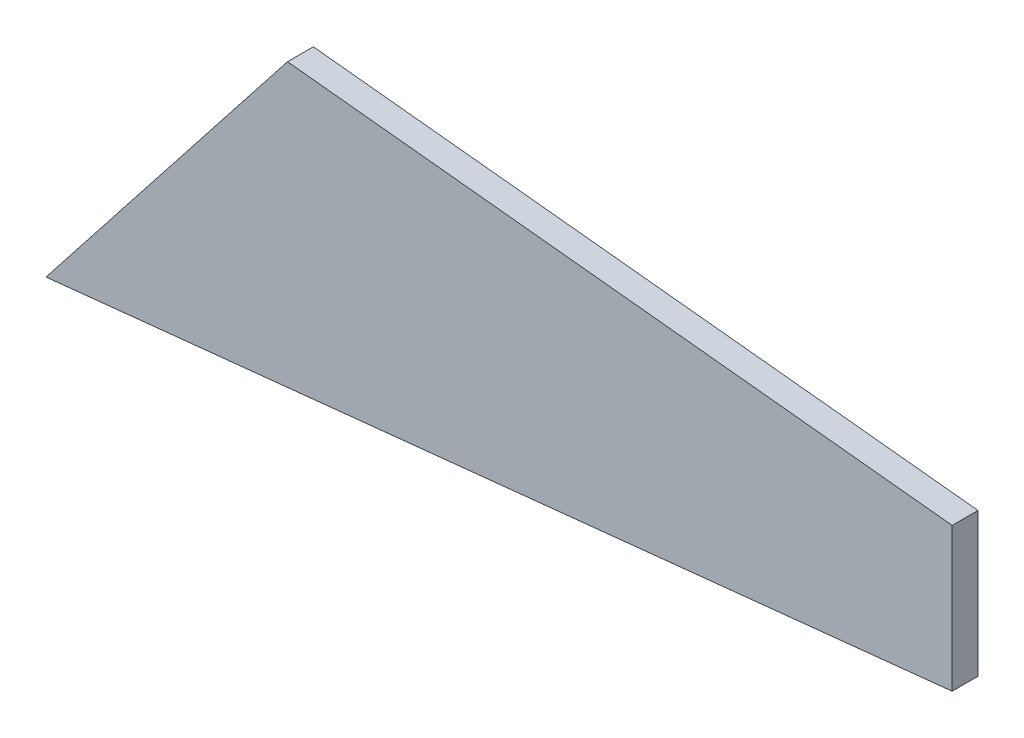
ISO-10303-21;
HEADER;
FILE_DESCRIPTION(('STEP AP214'),'2;1');
FILE_NAME('part.step','',(''),(''),'','','');
FILE_SCHEMA(('AUTOMOTIVE_DESIGN { 1 0 10303 214 1 1 1 1 }'));
ENDSEC;
DATA;
#1=APPLICATION_CONTEXT('core data for automotive mechanical design processes');
#2=APPLICATION_PROTOCOL_DEFINITION('international standard','automotive_design',2000,#1);
#3=PRODUCT_CONTEXT('',#1,'mechanical');
#4=PRODUCT('Part','Part','',(#3));
#5=PRODUCT_RELATED_PRODUCT_CATEGORY('part','',(#4));
#6=PRODUCT_DEFINITION_FORMATION('','',#4);
#7=PRODUCT_DEFINITION_CONTEXT('part definition',#1,'design');
#8=PRODUCT_DEFINITION('design','',#6,#7);
#9=PRODUCT_DEFINITION_SHAPE('','',#8);
#10=(LENGTH_UNIT() NAMED_UNIT(*) SI_UNIT(.MILLI.,.METRE.));
#11=(NAMED_UNIT(*) PLANE_ANGLE_UNIT() SI_UNIT($,.RADIAN.));
#12=(NAMED_UNIT(*) SI_UNIT($,.STERADIAN.) SOLID_ANGLE_UNIT());
#13=UNCERTAINTY_MEASURE_WITH_UNIT(LENGTH_MEASURE(1.E-05),#10,'distance_accuracy_value','');
#14=(GEOMETRIC_REPRESENTATION_CONTEXT(3) GLOBAL_UNCERTAINTY_ASSIGNED_CONTEXT((#13)) GLOBAL_UNIT_ASSIGNED_CONTEXT((#10,
#11,#12)) REPRESENTATION_CONTEXT('',''));
#15=CARTESIAN_POINT('',(0.,0.,0.));
#16=DIRECTION('',(0.,0.,1.));
#17=DIRECTION('',(1.,0.,0.));
#18=AXIS2_PLACEMENT_3D('',#15,#16,#17);
#19=CARTESIAN_POINT('',(180.,16.666666666667,0.));
#20=DIRECTION('',(-0.103606084258982,-0.994618408890827,0.));
#21=DIRECTION('',(-0.994618408890827,0.103606084258982,0.));
#22=AXIS2_PLACEMENT_3D('',#19,#20,#21);
#23=PLANE('',#22);
#24=DIRECTION('',(0.,0.,1.));
#25=VECTOR('',#24,1.);
#26=CARTESIAN_POINT('',(25.732634626158,32.736183893109,-10917.5));
#27=LINE('',#26,#25);
#28=CARTESIAN_POINT('',(25.732634626158,32.736183893109,0.));
#29=VERTEX_POINT('',#28);
#30=CARTESIAN_POINT('',(25.732634626158,32.736183893109,6.));
#31=VERTEX_POINT('',#30);
#32=EDGE_CURVE('E11',#29,#31,#27,.T.);
#33=ORIENTED_EDGE('',*,*,#32,.T.);
#34=DIRECTION('',(-0.994618408890827,0.103606084258982,0.));
#35=VECTOR('',#34,1.);
#36=CARTESIAN_POINT('',(180.,16.666666666667,6.));
#37=LINE('',#36,#35);
#38=CARTESIAN_POINT('',(180.,16.666666666667,6.));
#39=VERTEX_POINT('',#38);
#40=EDGE_CURVE('E25',#39,#31,#37,.T.);
#41=ORIENTED_EDGE('',*,*,#40,.F.);
#42=DIRECTION('',(0.,0.,1.));
#43=VECTOR('',#42,1.);
#44=CARTESIAN_POINT('',(180.,16.666666666667,0.));
#45=LINE('',#44,#43);
#46=CARTESIAN_POINT('',(180.,16.666666666667,0.));
#47=VERTEX_POINT('',#46);
#48=EDGE_CURVE('E103',#47,#39,#45,.T.);
#49=ORIENTED_EDGE('',*,*,#48,.F.);
#50=DIRECTION('',(-0.994618408890827,0.103606084258982,0.));
#51=VECTOR('',#50,1.);
#52=CARTESIAN_POINT('',(180.,16.666666666667,0.));
#53=LINE('',#52,#51);
#54=EDGE_CURVE('E74',#47,#29,#53,.T.);
#55=ORIENTED_EDGE('',*,*,#54,.T.);
#56=EDGE_LOOP('',(#33,#41,#49,#55));
#57=FACE_BOUND('',#56,.T.);
#58=ADVANCED_FACE('F17',(#57),#23,.F.);
#59=CARTESIAN_POINT('',(-11720.18096252,-14910.01620408,-21835.));
#60=DIRECTION('',(0.786185932195091,-0.617990032297072,0.));
#61=DIRECTION('',(0.,0.,-1.));
#62=AXIS2_PLACEMENT_3D('',#59,#60,#61);
#63=PLANE('',#62);
#64=ORIENTED_EDGE('',*,*,#32,.F.);
#65=DIRECTION('',(0.617990032297072,0.786185932195091,0.));
#66=VECTOR('',#65,1.);
#67=CARTESIAN_POINT('',(-5858.893496657,-7453.485338875,1.136868377216E-12));
#68=LINE('',#67,#66);
#69=CARTESIAN_POINT('',(-30.32250485139,-38.57526092202,2.273736754432E-13));
#70=VERTEX_POINT('',#69);
#71=EDGE_CURVE('E79',#70,#29,#68,.T.);
#72=ORIENTED_EDGE('',*,*,#71,.F.);
#73=DIRECTION('',(0.,0.,-1.));
#74=VECTOR('',#73,1.);
#75=CARTESIAN_POINT('',(-30.3225048514,-38.57526092202,-10917.5));
#76=LINE('',#75,#74);
#77=CARTESIAN_POINT('',(-30.32250485139,-38.57526092202,6.));
#78=VERTEX_POINT('',#77);
#79=EDGE_CURVE('E87',#78,#70,#76,.T.);
#80=ORIENTED_EDGE('',*,*,#79,.F.);
#81=DIRECTION('',(0.617990032297072,0.786185932195091,0.));
#82=VECTOR('',#81,1.);
#83=CARTESIAN_POINT('',(-5858.893496657,-7453.485338875,6.000000000001));
#84=LINE('',#83,#82);
#85=EDGE_CURVE('E111',#78,#31,#84,.T.);
#86=ORIENTED_EDGE('',*,*,#85,.T.);
#87=EDGE_LOOP('',(#64,#72,#80,#86));
#88=FACE_BOUND('',#87,.T.);
#89=ADVANCED_FACE('F119',(#88),#63,.F.);
#90=CARTESIAN_POINT('',(6.268384370371,5.684341886081E-13,6.));
#91=DIRECTION('',(0.,0.,1.));
#92=DIRECTION('',(0.,-1.,0.));
#93=AXIS2_PLACEMENT_3D('',#90,#91,#92);
#94=PLANE('',#93);
#95=ORIENTED_EDGE('',*,*,#85,.F.);
#96=DIRECTION('',(0.994618408890827,0.103606084258982,0.));
#97=VECTOR('',#96,1.);
#98=CARTESIAN_POINT('',(-140.,-50.,6.));
#99=LINE('',#98,#97);
#100=CARTESIAN_POINT('',(180.,-16.66666666666,6.));
#101=VERTEX_POINT('',#100);
#102=EDGE_CURVE('E94',#78,#101,#99,.T.);
#103=ORIENTED_EDGE('',*,*,#102,.T.);
#104=DIRECTION('',(0.,1.,0.));
#105=VECTOR('',#104,1.);
#106=CARTESIAN_POINT('',(180.,-16.66666666666,6.));
#107=LINE('',#106,#105);
#108=EDGE_CURVE('E91',#101,#39,#107,.T.);
#109=ORIENTED_EDGE('',*,*,#108,.T.);
#110=ORIENTED_EDGE('',*,*,#40,.T.);
#111=EDGE_LOOP('',(#95,#103,#109,#110));
#112=FACE_BOUND('',#111,.T.);
#113=ADVANCED_FACE('F117',(#112),#94,.T.);
#114=CARTESIAN_POINT('',(180.,-16.66666666666,0.));
#115=DIRECTION('',(-1.,0.,0.));
#116=DIRECTION('',(0.,1.,0.));
#117=AXIS2_PLACEMENT_3D('',#114,#115,#116);
#118=PLANE('',#117);
#119=DIRECTION('',(0.,1.,0.));
#120=VECTOR('',#119,1.);
#121=CARTESIAN_POINT('',(180.,-16.66666666666,0.));
#122=LINE('',#121,#120);
#123=CARTESIAN_POINT('',(180.,-16.66666666666,0.));
#124=VERTEX_POINT('',#123);
#125=EDGE_CURVE('E68',#124,#47,#122,.T.);
#126=ORIENTED_EDGE('',*,*,#125,.T.);
#127=ORIENTED_EDGE('',*,*,#48,.T.);
#128=ORIENTED_EDGE('',*,*,#108,.F.);
#129=DIRECTION('',(0.,0.,1.));
#130=VECTOR('',#129,1.);
#131=CARTESIAN_POINT('',(180.,-16.66666666666,0.));
#132=LINE('',#131,#130);
#133=EDGE_CURVE('E85',#124,#101,#132,.T.);
#134=ORIENTED_EDGE('',*,*,#133,.F.);
#135=EDGE_LOOP('',(#126,#127,#128,#134));
#136=FACE_BOUND('',#135,.T.);
#137=ADVANCED_FACE('F90',(#136),#118,.F.);
#138=CARTESIAN_POINT('',(6.268384370371,5.684341886081E-13,2.273736754432E-13));
#139=DIRECTION('',(0.,0.,1.));
#140=DIRECTION('',(0.,-1.,0.));
#141=AXIS2_PLACEMENT_3D('',#138,#139,#140);
#142=PLANE('',#141);
#143=ORIENTED_EDGE('',*,*,#54,.F.);
#144=ORIENTED_EDGE('',*,*,#125,.F.);
#145=DIRECTION('',(0.994618408890827,0.103606084258982,0.));
#146=VECTOR('',#145,1.);
#147=CARTESIAN_POINT('',(-140.,-50.,2.273736754432E-13));
#148=LINE('',#147,#146);
#149=EDGE_CURVE('E72',#70,#124,#148,.T.);
#150=ORIENTED_EDGE('',*,*,#149,.F.);
#151=ORIENTED_EDGE('',*,*,#71,.T.);
#152=EDGE_LOOP('',(#143,#144,#150,#151));
#153=FACE_BOUND('',#152,.T.);
#154=ADVANCED_FACE('F70',(#153),#142,.F.);
#155=CARTESIAN_POINT('',(-140.,-50.,2.273736754432E-13));
#156=DIRECTION('',(-0.103606084258982,0.994618408890827,0.));
#157=DIRECTION('',(0.,0.,1.));
#158=AXIS2_PLACEMENT_3D('',#155,#156,#157);
#159=PLANE('',#158);
#160=ORIENTED_EDGE('',*,*,#133,.T.);
#161=ORIENTED_EDGE('',*,*,#102,.F.);
#162=ORIENTED_EDGE('',*,*,#79,.T.);
#163=ORIENTED_EDGE('',*,*,#149,.T.);
#164=EDGE_LOOP('',(#160,#161,#162,#163));
#165=FACE_BOUND('',#164,.T.);
#166=ADVANCED_FACE('F83',(#165),#159,.F.);
#167=CLOSED_SHELL('',(#58,#89,#113,#137,#154,#166));
#168=MANIFOLD_SOLID_BREP('B1',#167);
#169=ADVANCED_BREP_SHAPE_REPRESENTATION('',(#18,#168),#14);
#170=SHAPE_DEFINITION_REPRESENTATION(#9,#169);
ENDSEC;
END-ISO-10303-21;
